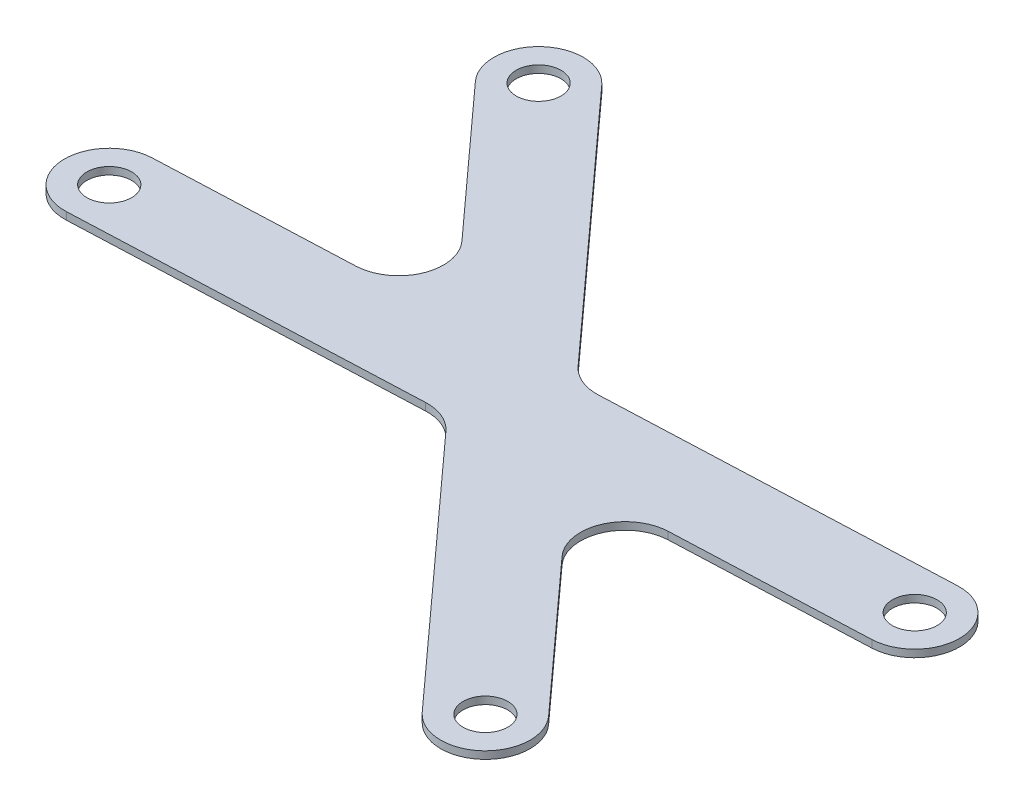
ISO-10303-21;
HEADER;
FILE_DESCRIPTION(('STEP AP214'),'2;1');
FILE_NAME('part.step','',(''),(''),'','','');
FILE_SCHEMA(('AUTOMOTIVE_DESIGN { 1 0 10303 214 1 1 1 1 }'));
ENDSEC;
DATA;
#1=APPLICATION_CONTEXT('core data for automotive mechanical design processes');
#2=APPLICATION_PROTOCOL_DEFINITION('international standard','automotive_design',2000,#1);
#3=PRODUCT_CONTEXT('',#1,'mechanical');
#4=PRODUCT('Part','Part','',(#3));
#5=PRODUCT_RELATED_PRODUCT_CATEGORY('part','',(#4));
#6=PRODUCT_DEFINITION_FORMATION('','',#4);
#7=PRODUCT_DEFINITION_CONTEXT('part definition',#1,'design');
#8=PRODUCT_DEFINITION('design','',#6,#7);
#9=PRODUCT_DEFINITION_SHAPE('','',#8);
#10=(LENGTH_UNIT() NAMED_UNIT(*) SI_UNIT(.MILLI.,.METRE.));
#11=(NAMED_UNIT(*) PLANE_ANGLE_UNIT() SI_UNIT($,.RADIAN.));
#12=(NAMED_UNIT(*) SI_UNIT($,.STERADIAN.) SOLID_ANGLE_UNIT());
#13=UNCERTAINTY_MEASURE_WITH_UNIT(LENGTH_MEASURE(1.E-05),#10,'distance_accuracy_value','');
#14=(GEOMETRIC_REPRESENTATION_CONTEXT(3) GLOBAL_UNCERTAINTY_ASSIGNED_CONTEXT((#13)) GLOBAL_UNIT_ASSIGNED_CONTEXT((#10,
#11,#12)) REPRESENTATION_CONTEXT('',''));
#15=CARTESIAN_POINT('',(0.,0.,0.));
#16=DIRECTION('',(0.,0.,1.));
#17=DIRECTION('',(1.,0.,0.));
#18=AXIS2_PLACEMENT_3D('',#15,#16,#17);
#19=CARTESIAN_POINT('',(-5.11351302513072,1.,12.2230484153319));
#20=DIRECTION('',(0.,-1.,0.));
#21=DIRECTION('',(0.,0.,-1.));
#22=AXIS2_PLACEMENT_3D('',#19,#20,#21);
#23=CYLINDRICAL_SURFACE('',#22,6.);
#24=DIRECTION('',(0.,1.,0.));
#25=VECTOR('',#24,1.);
#26=CARTESIAN_POINT('',(-5.36284124439167,1.,6.228231033703));
#27=LINE('',#26,#25);
#28=CARTESIAN_POINT('',(-5.36284124439167,0.,6.228231033703));
#29=VERTEX_POINT('',#28);
#30=CARTESIAN_POINT('',(-5.36284124439167,1.,6.228231033703));
#31=VERTEX_POINT('',#30);
#32=EDGE_CURVE('E11',#29,#31,#27,.T.);
#33=ORIENTED_EDGE('',*,*,#32,.F.);
#34=CARTESIAN_POINT('',(-5.11351302513072,0.,12.2230484153319));
#35=DIRECTION('',(0.,-1.,0.));
#36=DIRECTION('',(0.,0.,-1.));
#37=AXIS2_PLACEMENT_3D('',#34,#35,#36);
#38=CIRCLE('',#37,6.);
#39=CARTESIAN_POINT('',(-0.66969900100021,0.,8.19160736789726));
#40=VERTEX_POINT('',#39);
#41=EDGE_CURVE('E130',#29,#40,#38,.T.);
#42=ORIENTED_EDGE('',*,*,#41,.T.);
#43=DIRECTION('',(0.,1.,0.));
#44=VECTOR('',#43,1.);
#45=CARTESIAN_POINT('',(-0.669699001000211,1.,8.19160736789726));
#46=LINE('',#45,#44);
#47=CARTESIAN_POINT('',(-0.669699001000211,1.,8.19160736789726));
#48=VERTEX_POINT('',#47);
#49=EDGE_CURVE('E47',#40,#48,#46,.T.);
#50=ORIENTED_EDGE('',*,*,#49,.T.);
#51=CARTESIAN_POINT('',(-5.11351302513072,1.,12.2230484153319));
#52=DIRECTION('',(0.,-1.,0.));
#53=DIRECTION('',(0.,0.,-1.));
#54=AXIS2_PLACEMENT_3D('',#51,#52,#53);
#55=CIRCLE('',#54,6.);
#56=EDGE_CURVE('E229',#31,#48,#55,.T.);
#57=ORIENTED_EDGE('',*,*,#56,.F.);
#58=EDGE_LOOP('',(#33,#42,#50,#57));
#59=FACE_BOUND('',#58,.T.);
#60=ADVANCED_FACE('F37',(#59),#23,.F.);
#61=CARTESIAN_POINT('',(-0.669699001000211,1.,8.19160736789726));
#62=DIRECTION('',(0.740635670688418,0.,-0.671906841239109));
#63=DIRECTION('',(0.671906841239109,0.,0.740635670688418));
#64=AXIS2_PLACEMENT_3D('',#61,#62,#63);
#65=PLANE('',#64);
#66=ORIENTED_EDGE('',*,*,#49,.F.);
#67=DIRECTION('',(0.671906841239109,0.,0.740635670688418));
#68=VECTOR('',#67,1.);
#69=CARTESIAN_POINT('',(-0.669699001000211,0.,8.19160736789726));
#70=LINE('',#69,#68);
#71=CARTESIAN_POINT('',(30.4242022271197,0.,42.4660796264892));
#72=VERTEX_POINT('',#71);
#73=EDGE_CURVE('E173',#40,#72,#70,.T.);
#74=ORIENTED_EDGE('',*,*,#73,.T.);
#75=DIRECTION('',(0.,1.,0.));
#76=VECTOR('',#75,1.);
#77=CARTESIAN_POINT('',(30.4242022271197,1.,42.4660796264892));
#78=LINE('',#77,#76);
#79=CARTESIAN_POINT('',(30.4242022271197,1.,42.4660796264892));
#80=VERTEX_POINT('',#79);
#81=EDGE_CURVE('E222',#72,#80,#78,.T.);
#82=ORIENTED_EDGE('',*,*,#81,.T.);
#83=DIRECTION('',(0.671906841239109,0.,0.740635670688418));
#84=VECTOR('',#83,1.);
#85=CARTESIAN_POINT('',(-0.669699001000211,1.,8.19160736789726));
#86=LINE('',#85,#84);
#87=EDGE_CURVE('E239',#48,#80,#86,.T.);
#88=ORIENTED_EDGE('',*,*,#87,.F.);
#89=EDGE_LOOP('',(#66,#74,#82,#88));
#90=FACE_BOUND('',#89,.T.);
#91=ADVANCED_FACE('F242',(#90),#65,.F.);
#92=CARTESIAN_POINT('',(34.8680162512502,1.,38.4346385790546));
#93=DIRECTION('',(0.,1.,0.));
#94=DIRECTION('',(0.,0.,1.));
#95=AXIS2_PLACEMENT_3D('',#92,#93,#94);
#96=CYLINDRICAL_SURFACE('',#95,5.99999999999999);
#97=ORIENTED_EDGE('',*,*,#81,.F.);
#98=CARTESIAN_POINT('',(34.8680162512502,0.,38.4346385790546));
#99=DIRECTION('',(0.,1.,0.));
#100=DIRECTION('',(0.,0.,1.));
#101=AXIS2_PLACEMENT_3D('',#98,#99,#100);
#102=CIRCLE('',#101,5.99999999999999);
#103=CARTESIAN_POINT('',(39.3118302753807,0.,34.4031975316199));
#104=VERTEX_POINT('',#103);
#105=EDGE_CURVE('E170',#72,#104,#102,.T.);
#106=ORIENTED_EDGE('',*,*,#105,.T.);
#107=DIRECTION('',(0.,1.,0.));
#108=VECTOR('',#107,1.);
#109=CARTESIAN_POINT('',(39.3118302753807,1.,34.4031975316199));
#110=LINE('',#109,#108);
#111=CARTESIAN_POINT('',(39.3118302753807,1.,34.4031975316199));
#112=VERTEX_POINT('',#111);
#113=EDGE_CURVE('E219',#104,#112,#110,.T.);
#114=ORIENTED_EDGE('',*,*,#113,.T.);
#115=CARTESIAN_POINT('',(34.8680162512502,1.,38.4346385790546));
#116=DIRECTION('',(0.,1.,0.));
#117=DIRECTION('',(0.,0.,-1.));
#118=AXIS2_PLACEMENT_3D('',#115,#116,#117);
#119=CIRCLE('',#118,5.99999999999999);
#120=EDGE_CURVE('E243',#80,#112,#119,.T.);
#121=ORIENTED_EDGE('',*,*,#120,.F.);
#122=EDGE_LOOP('',(#97,#106,#114,#121));
#123=FACE_BOUND('',#122,.T.);
#124=ADVANCED_FACE('F308',(#123),#96,.T.);
#125=CARTESIAN_POINT('',(21.6690621358967,1.,14.9557643283957));
#126=DIRECTION('',(-0.740635670688418,0.,0.671906841239109));
#127=DIRECTION('',(-0.671906841239109,0.,-0.740635670688418));
#128=AXIS2_PLACEMENT_3D('',#125,#126,#127);
#129=PLANE('',#128);
#130=ORIENTED_EDGE('',*,*,#113,.F.);
#131=DIRECTION('',(-0.671906841239109,0.,-0.740635670688418));
#132=VECTOR('',#131,1.);
#133=CARTESIAN_POINT('',(21.6690621358967,0.,14.9557643283957));
#134=LINE('',#133,#132);
#135=CARTESIAN_POINT('',(21.6690621358967,0.,14.9557643283957));
#136=VERTEX_POINT('',#135);
#137=EDGE_CURVE('E167',#104,#136,#134,.T.);
#138=ORIENTED_EDGE('',*,*,#137,.T.);
#139=DIRECTION('',(0.,1.,0.));
#140=VECTOR('',#139,1.);
#141=CARTESIAN_POINT('',(21.6690621358967,1.,14.9557643283957));
#142=LINE('',#141,#140);
#143=CARTESIAN_POINT('',(21.6690621358967,1.,14.9557643283957));
#144=VERTEX_POINT('',#143);
#145=EDGE_CURVE('E216',#136,#144,#142,.T.);
#146=ORIENTED_EDGE('',*,*,#145,.T.);
#147=DIRECTION('',(-0.671906841239109,0.,-0.740635670688418));
#148=VECTOR('',#147,1.);
#149=CARTESIAN_POINT('',(21.6690621358967,1.,14.9557643283957));
#150=LINE('',#149,#148);
#151=EDGE_CURVE('E245',#112,#144,#150,.T.);
#152=ORIENTED_EDGE('',*,*,#151,.F.);
#153=EDGE_LOOP('',(#130,#138,#146,#152));
#154=FACE_BOUND('',#153,.T.);
#155=ADVANCED_FACE('F372',(#154),#129,.F.);
#156=CARTESIAN_POINT('',(26.1128761600272,1.,10.924323280961));
#157=DIRECTION('',(0.,-1.,0.));
#158=DIRECTION('',(0.,0.,-1.));
#159=AXIS2_PLACEMENT_3D('',#156,#157,#158);
#160=CYLINDRICAL_SURFACE('',#159,6.);
#161=ORIENTED_EDGE('',*,*,#145,.F.);
#162=CARTESIAN_POINT('',(26.1128761600272,0.,10.924323280961));
#163=DIRECTION('',(0.,-1.,0.));
#164=DIRECTION('',(0.,0.,-1.));
#165=AXIS2_PLACEMENT_3D('',#162,#163,#164);
#166=CIRCLE('',#165,6.);
#167=CARTESIAN_POINT('',(25.8635479407663,0.,4.92950589933213));
#168=VERTEX_POINT('',#167);
#169=EDGE_CURVE('E164',#136,#168,#166,.T.);
#170=ORIENTED_EDGE('',*,*,#169,.T.);
#171=DIRECTION('',(0.,1.,0.));
#172=VECTOR('',#171,1.);
#173=CARTESIAN_POINT('',(25.8635479407663,1.,4.92950589933213));
#174=LINE('',#173,#172);
#175=CARTESIAN_POINT('',(25.8635479407663,1.,4.92950589933213));
#176=VERTEX_POINT('',#175);
#177=EDGE_CURVE('E213',#168,#176,#174,.T.);
#178=ORIENTED_EDGE('',*,*,#177,.T.);
#179=CARTESIAN_POINT('',(26.1128761600272,1.,10.924323280961));
#180=DIRECTION('',(0.,-1.,0.));
#181=DIRECTION('',(0.,0.,-1.));
#182=AXIS2_PLACEMENT_3D('',#179,#180,#181);
#183=CIRCLE('',#182,6.);
#184=EDGE_CURVE('E251',#144,#176,#183,.T.);
#185=ORIENTED_EDGE('',*,*,#184,.F.);
#186=EDGE_LOOP('',(#161,#170,#178,#185));
#187=FACE_BOUND('',#186,.T.);
#188=ADVANCED_FACE('F382',(#187),#160,.F.);
#189=CARTESIAN_POINT('',(52.0986266280583,1.,3.83837250278885));
#190=DIRECTION('',(-0.0415547032101586,0.,-0.999136230271486));
#191=DIRECTION('',(0.999136230271486,0.,-0.0415547032101586));
#192=AXIS2_PLACEMENT_3D('',#189,#190,#191);
#193=PLANE('',#192);
#194=ORIENTED_EDGE('',*,*,#177,.F.);
#195=DIRECTION('',(0.999136230271486,0.,-0.0415547032101586));
#196=VECTOR('',#195,1.);
#197=CARTESIAN_POINT('',(52.0986266280583,0.,3.83837250278885));
#198=LINE('',#197,#196);
#199=CARTESIAN_POINT('',(52.0986266280583,0.,3.83837250278885));
#200=VERTEX_POINT('',#199);
#201=EDGE_CURVE('E161',#168,#200,#198,.T.);
#202=ORIENTED_EDGE('',*,*,#201,.T.);
#203=DIRECTION('',(0.,1.,0.));
#204=VECTOR('',#203,1.);
#205=CARTESIAN_POINT('',(52.0986266280583,1.,3.83837250278885));
#206=LINE('',#205,#204);
#207=CARTESIAN_POINT('',(52.0986266280583,1.,3.83837250278885));
#208=VERTEX_POINT('',#207);
#209=EDGE_CURVE('E210',#200,#208,#206,.T.);
#210=ORIENTED_EDGE('',*,*,#209,.T.);
#211=DIRECTION('',(0.999136230271486,0.,-0.0415547032101586));
#212=VECTOR('',#211,1.);
#213=CARTESIAN_POINT('',(52.0986266280583,1.,3.83837250278885));
#214=LINE('',#213,#212);
#215=EDGE_CURVE('E254',#176,#208,#214,.T.);
#216=ORIENTED_EDGE('',*,*,#215,.F.);
#217=EDGE_LOOP('',(#194,#202,#210,#216));
#218=FACE_BOUND('',#217,.T.);
#219=ADVANCED_FACE('F393',(#218),#193,.F.);
#220=CARTESIAN_POINT('',(51.8492984087974,1.,-2.15644487884007));
#221=DIRECTION('',(0.,1.,0.));
#222=DIRECTION('',(0.,0.,1.));
#223=AXIS2_PLACEMENT_3D('',#220,#221,#222);
#224=CYLINDRICAL_SURFACE('',#223,6.);
#225=ORIENTED_EDGE('',*,*,#209,.F.);
#226=CARTESIAN_POINT('',(51.8492984087974,0.,-2.15644487884007));
#227=DIRECTION('',(0.,1.,0.));
#228=DIRECTION('',(0.,0.,1.));
#229=AXIS2_PLACEMENT_3D('',#226,#227,#228);
#230=CIRCLE('',#229,6.);
#231=CARTESIAN_POINT('',(51.5999701895364,0.,-8.15126226046898));
#232=VERTEX_POINT('',#231);
#233=EDGE_CURVE('E158',#200,#232,#230,.T.);
#234=ORIENTED_EDGE('',*,*,#233,.T.);
#235=DIRECTION('',(0.,1.,0.));
#236=VECTOR('',#235,1.);
#237=CARTESIAN_POINT('',(51.5999701895364,1.,-8.15126226046898));
#238=LINE('',#237,#236);
#239=CARTESIAN_POINT('',(51.5999701895364,1.,-8.15126226046898));
#240=VERTEX_POINT('',#239);
#241=EDGE_CURVE('E207',#232,#240,#238,.T.);
#242=ORIENTED_EDGE('',*,*,#241,.T.);
#243=CARTESIAN_POINT('',(51.8492984087974,1.,-2.15644487884007));
#244=DIRECTION('',(0.,1.,0.));
#245=DIRECTION('',(0.,0.,1.));
#246=AXIS2_PLACEMENT_3D('',#243,#244,#245);
#247=CIRCLE('',#246,6.);
#248=EDGE_CURVE('E257',#208,#240,#247,.T.);
#249=ORIENTED_EDGE('',*,*,#248,.F.);
#250=EDGE_LOOP('',(#225,#234,#242,#249));
#251=FACE_BOUND('',#250,.T.);
#252=ADVANCED_FACE('F404',(#251),#224,.T.);
#253=CARTESIAN_POINT('',(5.36284124439164,1.,-6.228231033703));
#254=DIRECTION('',(0.0415547032101585,0.,0.999136230271486));
#255=DIRECTION('',(-0.999136230271486,0.,0.0415547032101585));
#256=AXIS2_PLACEMENT_3D('',#253,#254,#255);
#257=PLANE('',#256);
#258=ORIENTED_EDGE('',*,*,#241,.F.);
#259=DIRECTION('',(-0.999136230271486,0.,0.0415547032101585));
#260=VECTOR('',#259,1.);
#261=CARTESIAN_POINT('',(5.36284124439164,0.,-6.228231033703));
#262=LINE('',#261,#260);
#263=CARTESIAN_POINT('',(5.36284124439164,0.,-6.228231033703));
#264=VERTEX_POINT('',#263);
#265=EDGE_CURVE('E155',#232,#264,#262,.T.);
#266=ORIENTED_EDGE('',*,*,#265,.T.);
#267=DIRECTION('',(0.,1.,0.));
#268=VECTOR('',#267,1.);
#269=CARTESIAN_POINT('',(5.36284124439164,1.,-6.228231033703));
#270=LINE('',#269,#268);
#271=CARTESIAN_POINT('',(5.36284124439164,1.,-6.228231033703));
#272=VERTEX_POINT('',#271);
#273=EDGE_CURVE('E204',#264,#272,#270,.T.);
#274=ORIENTED_EDGE('',*,*,#273,.T.);
#275=DIRECTION('',(-0.999136230271486,0.,0.0415547032101585));
#276=VECTOR('',#275,1.);
#277=CARTESIAN_POINT('',(5.36284124439164,1.,-6.228231033703));
#278=LINE('',#277,#276);
#279=EDGE_CURVE('E260',#240,#272,#278,.T.);
#280=ORIENTED_EDGE('',*,*,#279,.F.);
#281=EDGE_LOOP('',(#258,#266,#274,#280));
#282=FACE_BOUND('',#281,.T.);
#283=ADVANCED_FACE('F415',(#282),#257,.F.);
#284=CARTESIAN_POINT('',(5.11351302513069,1.,-12.2230484153319));
#285=DIRECTION('',(0.,-1.,0.));
#286=DIRECTION('',(0.,0.,-1.));
#287=AXIS2_PLACEMENT_3D('',#284,#285,#286);
#288=CYLINDRICAL_SURFACE('',#287,6.);
#289=ORIENTED_EDGE('',*,*,#273,.F.);
#290=CARTESIAN_POINT('',(5.11351302513069,0.,-12.2230484153319));
#291=DIRECTION('',(0.,-1.,0.));
#292=DIRECTION('',(0.,0.,-1.));
#293=AXIS2_PLACEMENT_3D('',#290,#291,#292);
#294=CIRCLE('',#293,6.);
#295=CARTESIAN_POINT('',(0.669699001000189,0.,-8.19160736789726));
#296=VERTEX_POINT('',#295);
#297=EDGE_CURVE('E152',#264,#296,#294,.T.);
#298=ORIENTED_EDGE('',*,*,#297,.T.);
#299=DIRECTION('',(0.,1.,0.));
#300=VECTOR('',#299,1.);
#301=CARTESIAN_POINT('',(0.669699001000186,1.,-8.19160736789726));
#302=LINE('',#301,#300);
#303=CARTESIAN_POINT('',(0.669699001000186,1.,-8.19160736789726));
#304=VERTEX_POINT('',#303);
#305=EDGE_CURVE('E201',#296,#304,#302,.T.);
#306=ORIENTED_EDGE('',*,*,#305,.T.);
#307=CARTESIAN_POINT('',(5.11351302513069,1.,-12.2230484153319));
#308=DIRECTION('',(0.,-1.,0.));
#309=DIRECTION('',(0.,0.,-1.));
#310=AXIS2_PLACEMENT_3D('',#307,#308,#309);
#311=CIRCLE('',#310,6.);
#312=EDGE_CURVE('E263',#272,#304,#311,.T.);
#313=ORIENTED_EDGE('',*,*,#312,.F.);
#314=EDGE_LOOP('',(#289,#298,#306,#313));
#315=FACE_BOUND('',#314,.T.);
#316=ADVANCED_FACE('F426',(#315),#288,.F.);
#317=CARTESIAN_POINT('',(-30.4242022271197,1.,-42.4660796264892));
#318=DIRECTION('',(-0.740635670688418,0.,0.671906841239109));
#319=DIRECTION('',(-0.671906841239109,0.,-0.740635670688418));
#320=AXIS2_PLACEMENT_3D('',#317,#318,#319);
#321=PLANE('',#320);
#322=ORIENTED_EDGE('',*,*,#305,.F.);
#323=DIRECTION('',(-0.671906841239109,0.,-0.740635670688418));
#324=VECTOR('',#323,1.);
#325=CARTESIAN_POINT('',(-30.4242022271197,0.,-42.4660796264892));
#326=LINE('',#325,#324);
#327=CARTESIAN_POINT('',(-30.4242022271197,0.,-42.4660796264892));
#328=VERTEX_POINT('',#327);
#329=EDGE_CURVE('E149',#296,#328,#326,.T.);
#330=ORIENTED_EDGE('',*,*,#329,.T.);
#331=DIRECTION('',(0.,1.,0.));
#332=VECTOR('',#331,1.);
#333=CARTESIAN_POINT('',(-30.4242022271197,1.,-42.4660796264892));
#334=LINE('',#333,#332);
#335=CARTESIAN_POINT('',(-30.4242022271197,1.,-42.4660796264892));
#336=VERTEX_POINT('',#335);
#337=EDGE_CURVE('E198',#328,#336,#334,.T.);
#338=ORIENTED_EDGE('',*,*,#337,.T.);
#339=DIRECTION('',(-0.671906841239109,0.,-0.740635670688418));
#340=VECTOR('',#339,1.);
#341=CARTESIAN_POINT('',(-30.4242022271197,1.,-42.4660796264892));
#342=LINE('',#341,#340);
#343=EDGE_CURVE('E266',#304,#336,#342,.T.);
#344=ORIENTED_EDGE('',*,*,#343,.F.);
#345=EDGE_LOOP('',(#322,#330,#338,#344));
#346=FACE_BOUND('',#345,.T.);
#347=ADVANCED_FACE('F437',(#346),#321,.F.);
#348=CARTESIAN_POINT('',(-34.8680162512502,1.,-38.4346385790546));
#349=DIRECTION('',(0.,1.,0.));
#350=DIRECTION('',(0.,0.,1.));
#351=AXIS2_PLACEMENT_3D('',#348,#349,#350);
#352=CYLINDRICAL_SURFACE('',#351,5.99999999999999);
#353=ORIENTED_EDGE('',*,*,#337,.F.);
#354=CARTESIAN_POINT('',(-34.8680162512502,0.,-38.4346385790546));
#355=DIRECTION('',(0.,1.,0.));
#356=DIRECTION('',(0.,0.,1.));
#357=AXIS2_PLACEMENT_3D('',#354,#355,#356);
#358=CIRCLE('',#357,5.99999999999999);
#359=CARTESIAN_POINT('',(-39.3118302753807,0.,-34.4031975316199));
#360=VERTEX_POINT('',#359);
#361=EDGE_CURVE('E146',#328,#360,#358,.T.);
#362=ORIENTED_EDGE('',*,*,#361,.T.);
#363=DIRECTION('',(0.,1.,0.));
#364=VECTOR('',#363,1.);
#365=CARTESIAN_POINT('',(-39.3118302753807,1.,-34.4031975316199));
#366=LINE('',#365,#364);
#367=CARTESIAN_POINT('',(-39.3118302753807,1.,-34.4031975316199));
#368=VERTEX_POINT('',#367);
#369=EDGE_CURVE('E195',#360,#368,#366,.T.);
#370=ORIENTED_EDGE('',*,*,#369,.T.);
#371=CARTESIAN_POINT('',(-34.8680162512502,1.,-38.4346385790546));
#372=DIRECTION('',(0.,1.,0.));
#373=DIRECTION('',(0.,0.,1.));
#374=AXIS2_PLACEMENT_3D('',#371,#372,#373);
#375=CIRCLE('',#374,5.99999999999999);
#376=EDGE_CURVE('E269',#336,#368,#375,.T.);
#377=ORIENTED_EDGE('',*,*,#376,.F.);
#378=EDGE_LOOP('',(#353,#362,#370,#377));
#379=FACE_BOUND('',#378,.T.);
#380=ADVANCED_FACE('F448',(#379),#352,.T.);
#381=CARTESIAN_POINT('',(-21.6690621358967,1.,-14.9557643283957));
#382=DIRECTION('',(0.740635670688418,0.,-0.67190684123911));
#383=DIRECTION('',(0.671906841239109,0.,0.740635670688418));
#384=AXIS2_PLACEMENT_3D('',#381,#382,#383);
#385=PLANE('',#384);
#386=ORIENTED_EDGE('',*,*,#369,.F.);
#387=DIRECTION('',(0.671906841239109,0.,0.740635670688418));
#388=VECTOR('',#387,1.);
#389=CARTESIAN_POINT('',(-21.6690621358967,0.,-14.9557643283957));
#390=LINE('',#389,#388);
#391=CARTESIAN_POINT('',(-21.6690621358967,0.,-14.9557643283957));
#392=VERTEX_POINT('',#391);
#393=EDGE_CURVE('E143',#360,#392,#390,.T.);
#394=ORIENTED_EDGE('',*,*,#393,.T.);
#395=DIRECTION('',(0.,1.,0.));
#396=VECTOR('',#395,1.);
#397=CARTESIAN_POINT('',(-21.6690621358967,1.,-14.9557643283957));
#398=LINE('',#397,#396);
#399=CARTESIAN_POINT('',(-21.6690621358967,1.,-14.9557643283957));
#400=VERTEX_POINT('',#399);
#401=EDGE_CURVE('E192',#392,#400,#398,.T.);
#402=ORIENTED_EDGE('',*,*,#401,.T.);
#403=DIRECTION('',(0.671906841239109,0.,0.740635670688418));
#404=VECTOR('',#403,1.);
#405=CARTESIAN_POINT('',(-21.6690621358967,1.,-14.9557643283957));
#406=LINE('',#405,#404);
#407=EDGE_CURVE('E272',#368,#400,#406,.T.);
#408=ORIENTED_EDGE('',*,*,#407,.F.);
#409=EDGE_LOOP('',(#386,#394,#402,#408));
#410=FACE_BOUND('',#409,.T.);
#411=ADVANCED_FACE('F459',(#410),#385,.F.);
#412=CARTESIAN_POINT('',(-26.1128761600273,1.,-10.924323280961));
#413=DIRECTION('',(0.,-1.,0.));
#414=DIRECTION('',(0.,0.,-1.));
#415=AXIS2_PLACEMENT_3D('',#412,#413,#414);
#416=CYLINDRICAL_SURFACE('',#415,6.);
#417=ORIENTED_EDGE('',*,*,#401,.F.);
#418=CARTESIAN_POINT('',(-26.1128761600273,0.,-10.924323280961));
#419=DIRECTION('',(0.,-1.,0.));
#420=DIRECTION('',(0.,0.,-1.));
#421=AXIS2_PLACEMENT_3D('',#418,#419,#420);
#422=CIRCLE('',#421,6.);
#423=CARTESIAN_POINT('',(-25.8635479407663,0.,-4.92950589933213));
#424=VERTEX_POINT('',#423);
#425=EDGE_CURVE('E140',#392,#424,#422,.T.);
#426=ORIENTED_EDGE('',*,*,#425,.T.);
#427=DIRECTION('',(0.,1.,0.));
#428=VECTOR('',#427,1.);
#429=CARTESIAN_POINT('',(-25.8635479407663,1.,-4.92950589933213));
#430=LINE('',#429,#428);
#431=CARTESIAN_POINT('',(-25.8635479407663,1.,-4.92950589933213));
#432=VERTEX_POINT('',#431);
#433=EDGE_CURVE('E190',#424,#432,#430,.T.);
#434=ORIENTED_EDGE('',*,*,#433,.T.);
#435=CARTESIAN_POINT('',(-26.1128761600273,1.,-10.924323280961));
#436=DIRECTION('',(0.,-1.,0.));
#437=DIRECTION('',(0.,0.,-1.));
#438=AXIS2_PLACEMENT_3D('',#435,#436,#437);
#439=CIRCLE('',#438,6.);
#440=EDGE_CURVE('E275',#400,#432,#439,.T.);
#441=ORIENTED_EDGE('',*,*,#440,.F.);
#442=EDGE_LOOP('',(#417,#426,#434,#441));
#443=FACE_BOUND('',#442,.T.);
#444=ADVANCED_FACE('F470',(#443),#416,.F.);
#445=CARTESIAN_POINT('',(-52.0986266280584,1.,-3.83837250278885));
#446=DIRECTION('',(0.0415547032101586,0.,0.999136230271486));
#447=DIRECTION('',(-0.999136230271486,0.,0.0415547032101586));
#448=AXIS2_PLACEMENT_3D('',#445,#446,#447);
#449=PLANE('',#448);
#450=ORIENTED_EDGE('',*,*,#433,.F.);
#451=DIRECTION('',(-0.999136230271486,0.,0.0415547032101586));
#452=VECTOR('',#451,1.);
#453=CARTESIAN_POINT('',(-52.0986266280584,0.,-3.83837250278885));
#454=LINE('',#453,#452);
#455=CARTESIAN_POINT('',(-52.0986266280584,0.,-3.83837250278885));
#456=VERTEX_POINT('',#455);
#457=EDGE_CURVE('E137',#424,#456,#454,.T.);
#458=ORIENTED_EDGE('',*,*,#457,.T.);
#459=DIRECTION('',(0.,1.,0.));
#460=VECTOR('',#459,1.);
#461=CARTESIAN_POINT('',(-52.0986266280584,1.,-3.83837250278885));
#462=LINE('',#461,#460);
#463=CARTESIAN_POINT('',(-52.0986266280584,1.,-3.83837250278885));
#464=VERTEX_POINT('',#463);
#465=EDGE_CURVE('E55',#456,#464,#462,.T.);
#466=ORIENTED_EDGE('',*,*,#465,.T.);
#467=DIRECTION('',(-0.999136230271486,0.,0.0415547032101586));
#468=VECTOR('',#467,1.);
#469=CARTESIAN_POINT('',(-52.0986266280584,1.,-3.83837250278885));
#470=LINE('',#469,#468);
#471=EDGE_CURVE('E278',#432,#464,#470,.T.);
#472=ORIENTED_EDGE('',*,*,#471,.F.);
#473=EDGE_LOOP('',(#450,#458,#466,#472));
#474=FACE_BOUND('',#473,.T.);
#475=ADVANCED_FACE('F481',(#474),#449,.F.);
#476=CARTESIAN_POINT('',(-51.8492984087974,1.,2.15644487884007));
#477=DIRECTION('',(0.,1.,0.));
#478=DIRECTION('',(0.,0.,1.));
#479=AXIS2_PLACEMENT_3D('',#476,#477,#478);
#480=CYLINDRICAL_SURFACE('',#479,6.);
#481=ORIENTED_EDGE('',*,*,#465,.F.);
#482=CARTESIAN_POINT('',(-51.8492984087974,0.,2.15644487884007));
#483=DIRECTION('',(0.,1.,0.));
#484=DIRECTION('',(0.,0.,1.));
#485=AXIS2_PLACEMENT_3D('',#482,#483,#484);
#486=CIRCLE('',#485,6.);
#487=CARTESIAN_POINT('',(-51.5999701895365,0.,8.15126226046898));
#488=VERTEX_POINT('',#487);
#489=EDGE_CURVE('E128',#456,#488,#486,.T.);
#490=ORIENTED_EDGE('',*,*,#489,.T.);
#491=DIRECTION('',(0.,1.,0.));
#492=VECTOR('',#491,1.);
#493=CARTESIAN_POINT('',(-51.5999701895365,1.,8.15126226046898));
#494=LINE('',#493,#492);
#495=CARTESIAN_POINT('',(-51.5999701895365,1.,8.15126226046898));
#496=VERTEX_POINT('',#495);
#497=EDGE_CURVE('E41',#488,#496,#494,.T.);
#498=ORIENTED_EDGE('',*,*,#497,.T.);
#499=CARTESIAN_POINT('',(-51.8492984087974,1.,2.15644487884007));
#500=DIRECTION('',(0.,1.,0.));
#501=DIRECTION('',(0.,0.,-1.));
#502=AXIS2_PLACEMENT_3D('',#499,#500,#501);
#503=CIRCLE('',#502,6.);
#504=EDGE_CURVE('E188',#464,#496,#503,.T.);
#505=ORIENTED_EDGE('',*,*,#504,.F.);
#506=EDGE_LOOP('',(#481,#490,#498,#505));
#507=FACE_BOUND('',#506,.T.);
#508=ADVANCED_FACE('F132',(#507),#480,.T.);
#509=CARTESIAN_POINT('',(-51.5999701895365,1.,8.15126226046898));
#510=DIRECTION('',(-0.0415547032101583,0.,-0.999136230271486));
#511=DIRECTION('',(0.999136230271486,0.,-0.0415547032101583));
#512=AXIS2_PLACEMENT_3D('',#509,#510,#511);
#513=PLANE('',#512);
#514=DIRECTION('',(0.999136230271486,0.,-0.0415547032101583));
#515=VECTOR('',#514,1.);
#516=CARTESIAN_POINT('',(-51.5999701895365,0.,8.15126226046898));
#517=LINE('',#516,#515);
#518=EDGE_CURVE('E116',#488,#29,#517,.T.);
#519=ORIENTED_EDGE('',*,*,#518,.T.);
#520=ORIENTED_EDGE('',*,*,#32,.T.);
#521=DIRECTION('',(0.999136230271486,0.,-0.0415547032101583));
#522=VECTOR('',#521,1.);
#523=CARTESIAN_POINT('',(-51.5999701895365,1.,8.15126226046898));
#524=LINE('',#523,#522);
#525=EDGE_CURVE('E118',#496,#31,#524,.T.);
#526=ORIENTED_EDGE('',*,*,#525,.F.);
#527=ORIENTED_EDGE('',*,*,#497,.F.);
#528=EDGE_LOOP('',(#519,#520,#526,#527));
#529=FACE_BOUND('',#528,.T.);
#530=ADVANCED_FACE('F115',(#529),#513,.F.);
#531=CARTESIAN_POINT('',(-34.8680162512502,1.,-38.4346385790546));
#532=DIRECTION('',(0.,1.,0.));
#533=DIRECTION('',(0.,0.,1.));
#534=AXIS2_PLACEMENT_3D('',#531,#532,#533);
#535=CYLINDRICAL_SURFACE('',#534,3.);
#536=CARTESIAN_POINT('',(-34.8680162512502,1.,-38.4346385790546));
#537=DIRECTION('',(0.,1.,0.));
#538=DIRECTION('',(0.,0.,1.));
#539=AXIS2_PLACEMENT_3D('',#536,#537,#538);
#540=CIRCLE('',#539,3.);
#541=CARTESIAN_POINT('',(-34.8680162512502,1.,-35.4346385790546));
#542=VERTEX_POINT('',#541);
#543=EDGE_CURVE('E281',#542,#542,#540,.T.);
#544=ORIENTED_EDGE('',*,*,#543,.T.);
#545=EDGE_LOOP('',(#544));
#546=FACE_BOUND('',#545,.T.);
#547=CARTESIAN_POINT('',(-34.8680162512502,0.,-38.4346385790546));
#548=DIRECTION('',(0.,1.,0.));
#549=DIRECTION('',(0.,0.,1.));
#550=AXIS2_PLACEMENT_3D('',#547,#548,#549);
#551=CIRCLE('',#550,3.);
#552=CARTESIAN_POINT('',(-34.8680162512502,0.,-35.4346385790546));
#553=VERTEX_POINT('',#552);
#554=EDGE_CURVE('E139',#553,#553,#551,.T.);
#555=ORIENTED_EDGE('',*,*,#554,.F.);
#556=EDGE_LOOP('',(#555));
#557=FACE_BOUND('',#556,.T.);
#558=ADVANCED_FACE('F314',(#546,#557),#535,.F.);
#559=CARTESIAN_POINT('',(51.8492984087974,1.,-2.15644487884007));
#560=DIRECTION('',(0.,1.,0.));
#561=DIRECTION('',(0.,0.,1.));
#562=AXIS2_PLACEMENT_3D('',#559,#560,#561);
#563=CYLINDRICAL_SURFACE('',#562,3.);
#564=CARTESIAN_POINT('',(51.8492984087974,1.,-2.15644487884007));
#565=DIRECTION('',(0.,1.,0.));
#566=DIRECTION('',(0.,0.,1.));
#567=AXIS2_PLACEMENT_3D('',#564,#565,#566);
#568=CIRCLE('',#567,3.);
#569=CARTESIAN_POINT('',(51.8492984087974,1.,0.843555121159934));
#570=VERTEX_POINT('',#569);
#571=EDGE_CURVE('E284',#570,#570,#568,.T.);
#572=ORIENTED_EDGE('',*,*,#571,.T.);
#573=EDGE_LOOP('',(#572));
#574=FACE_BOUND('',#573,.T.);
#575=CARTESIAN_POINT('',(51.8492984087974,0.,-2.15644487884007));
#576=DIRECTION('',(0.,1.,0.));
#577=DIRECTION('',(0.,0.,1.));
#578=AXIS2_PLACEMENT_3D('',#575,#576,#577);
#579=CIRCLE('',#578,3.);
#580=CARTESIAN_POINT('',(51.8492984087974,0.,0.843555121159934));
#581=VERTEX_POINT('',#580);
#582=EDGE_CURVE('E179',#581,#581,#579,.T.);
#583=ORIENTED_EDGE('',*,*,#582,.F.);
#584=EDGE_LOOP('',(#583));
#585=FACE_BOUND('',#584,.T.);
#586=ADVANCED_FACE('F317',(#574,#585),#563,.F.);
#587=CARTESIAN_POINT('',(34.8680162512502,1.,38.4346385790546));
#588=DIRECTION('',(0.,1.,0.));
#589=DIRECTION('',(0.,0.,1.));
#590=AXIS2_PLACEMENT_3D('',#587,#588,#589);
#591=CYLINDRICAL_SURFACE('',#590,2.99999999999999);
#592=CARTESIAN_POINT('',(34.8680162512502,1.,38.4346385790546));
#593=DIRECTION('',(0.,1.,0.));
#594=DIRECTION('',(0.,0.,1.));
#595=AXIS2_PLACEMENT_3D('',#592,#593,#594);
#596=CIRCLE('',#595,2.99999999999999);
#597=CARTESIAN_POINT('',(34.8680162512502,1.,41.4346385790546));
#598=VERTEX_POINT('',#597);
#599=EDGE_CURVE('E286',#598,#598,#596,.T.);
#600=ORIENTED_EDGE('',*,*,#599,.T.);
#601=EDGE_LOOP('',(#600));
#602=FACE_BOUND('',#601,.T.);
#603=CARTESIAN_POINT('',(34.8680162512502,0.,38.4346385790546));
#604=DIRECTION('',(0.,1.,0.));
#605=DIRECTION('',(0.,0.,1.));
#606=AXIS2_PLACEMENT_3D('',#603,#604,#605);
#607=CIRCLE('',#606,2.99999999999999);
#608=CARTESIAN_POINT('',(34.8680162512502,0.,41.4346385790546));
#609=VERTEX_POINT('',#608);
#610=EDGE_CURVE('E182',#609,#609,#607,.T.);
#611=ORIENTED_EDGE('',*,*,#610,.F.);
#612=EDGE_LOOP('',(#611));
#613=FACE_BOUND('',#612,.T.);
#614=ADVANCED_FACE('F302',(#602,#613),#591,.F.);
#615=CARTESIAN_POINT('',(-51.8492984087974,1.,2.15644487884007));
#616=DIRECTION('',(0.,1.,0.));
#617=DIRECTION('',(0.,0.,1.));
#618=AXIS2_PLACEMENT_3D('',#615,#616,#617);
#619=CYLINDRICAL_SURFACE('',#618,3.);
#620=CARTESIAN_POINT('',(-51.8492984087974,1.,2.15644487884007));
#621=DIRECTION('',(0.,1.,0.));
#622=DIRECTION('',(0.,0.,1.));
#623=AXIS2_PLACEMENT_3D('',#620,#621,#622);
#624=CIRCLE('',#623,3.);
#625=CARTESIAN_POINT('',(-51.8492984087974,1.,5.15644487884007));
#626=VERTEX_POINT('',#625);
#627=EDGE_CURVE('E122',#626,#626,#624,.T.);
#628=ORIENTED_EDGE('',*,*,#627,.T.);
#629=EDGE_LOOP('',(#628));
#630=FACE_BOUND('',#629,.T.);
#631=CARTESIAN_POINT('',(-51.8492984087974,0.,2.15644487884007));
#632=DIRECTION('',(0.,1.,0.));
#633=DIRECTION('',(0.,0.,1.));
#634=AXIS2_PLACEMENT_3D('',#631,#632,#633);
#635=CIRCLE('',#634,3.);
#636=CARTESIAN_POINT('',(-51.8492984087974,0.,5.15644487884007));
#637=VERTEX_POINT('',#636);
#638=EDGE_CURVE('E185',#637,#637,#635,.T.);
#639=ORIENTED_EDGE('',*,*,#638,.F.);
#640=EDGE_LOOP('',(#639));
#641=FACE_BOUND('',#640,.T.);
#642=ADVANCED_FACE('F39',(#630,#641),#619,.F.);
#643=CARTESIAN_POINT('',(-51.8492984087974,1.,2.15644487884007));
#644=DIRECTION('',(0.,-1.,0.));
#645=DIRECTION('',(0.,0.,-1.));
#646=AXIS2_PLACEMENT_3D('',#643,#644,#645);
#647=PLANE('',#646);
#648=ORIENTED_EDGE('',*,*,#504,.T.);
#649=ORIENTED_EDGE('',*,*,#525,.T.);
#650=ORIENTED_EDGE('',*,*,#56,.T.);
#651=ORIENTED_EDGE('',*,*,#87,.T.);
#652=ORIENTED_EDGE('',*,*,#120,.T.);
#653=ORIENTED_EDGE('',*,*,#151,.T.);
#654=ORIENTED_EDGE('',*,*,#184,.T.);
#655=ORIENTED_EDGE('',*,*,#215,.T.);
#656=ORIENTED_EDGE('',*,*,#248,.T.);
#657=ORIENTED_EDGE('',*,*,#279,.T.);
#658=ORIENTED_EDGE('',*,*,#312,.T.);
#659=ORIENTED_EDGE('',*,*,#343,.T.);
#660=ORIENTED_EDGE('',*,*,#376,.T.);
#661=ORIENTED_EDGE('',*,*,#407,.T.);
#662=ORIENTED_EDGE('',*,*,#440,.T.);
#663=ORIENTED_EDGE('',*,*,#471,.T.);
#664=EDGE_LOOP('',(#648,#649,#650,#651,#652,#653,#654,#655,#656,#657,#658,#659,#660,#661,#662,#663));
#665=FACE_BOUND('',#664,.T.);
#666=ORIENTED_EDGE('',*,*,#543,.F.);
#667=EDGE_LOOP('',(#666));
#668=FACE_BOUND('',#667,.T.);
#669=ORIENTED_EDGE('',*,*,#571,.F.);
#670=EDGE_LOOP('',(#669));
#671=FACE_BOUND('',#670,.T.);
#672=ORIENTED_EDGE('',*,*,#599,.F.);
#673=EDGE_LOOP('',(#672));
#674=FACE_BOUND('',#673,.T.);
#675=ORIENTED_EDGE('',*,*,#627,.F.);
#676=EDGE_LOOP('',(#675));
#677=FACE_BOUND('',#676,.T.);
#678=ADVANCED_FACE('F236',(#665,#668,#671,#674,#677),#647,.F.);
#679=CARTESIAN_POINT('',(-51.8492984087974,0.,2.15644487884007));
#680=DIRECTION('',(0.,-1.,0.));
#681=DIRECTION('',(0.,0.,-1.));
#682=AXIS2_PLACEMENT_3D('',#679,#680,#681);
#683=PLANE('',#682);
#684=ORIENTED_EDGE('',*,*,#489,.F.);
#685=ORIENTED_EDGE('',*,*,#457,.F.);
#686=ORIENTED_EDGE('',*,*,#425,.F.);
#687=ORIENTED_EDGE('',*,*,#393,.F.);
#688=ORIENTED_EDGE('',*,*,#361,.F.);
#689=ORIENTED_EDGE('',*,*,#329,.F.);
#690=ORIENTED_EDGE('',*,*,#297,.F.);
#691=ORIENTED_EDGE('',*,*,#265,.F.);
#692=ORIENTED_EDGE('',*,*,#233,.F.);
#693=ORIENTED_EDGE('',*,*,#201,.F.);
#694=ORIENTED_EDGE('',*,*,#169,.F.);
#695=ORIENTED_EDGE('',*,*,#137,.F.);
#696=ORIENTED_EDGE('',*,*,#105,.F.);
#697=ORIENTED_EDGE('',*,*,#73,.F.);
#698=ORIENTED_EDGE('',*,*,#41,.F.);
#699=ORIENTED_EDGE('',*,*,#518,.F.);
#700=EDGE_LOOP('',(#684,#685,#686,#687,#688,#689,#690,#691,#692,#693,#694,#695,#696,#697,#698,#699));
#701=FACE_BOUND('',#700,.T.);
#702=ORIENTED_EDGE('',*,*,#554,.T.);
#703=EDGE_LOOP('',(#702));
#704=FACE_BOUND('',#703,.T.);
#705=ORIENTED_EDGE('',*,*,#582,.T.);
#706=EDGE_LOOP('',(#705));
#707=FACE_BOUND('',#706,.T.);
#708=ORIENTED_EDGE('',*,*,#610,.T.);
#709=EDGE_LOOP('',(#708));
#710=FACE_BOUND('',#709,.T.);
#711=ORIENTED_EDGE('',*,*,#638,.T.);
#712=EDGE_LOOP('',(#711));
#713=FACE_BOUND('',#712,.T.);
#714=ADVANCED_FACE('F125',(#701,#704,#707,#710,#713),#683,.T.);
#715=CLOSED_SHELL('',(#60,#91,#124,#155,#188,#219,#252,#283,#316,#347,#380,#411,#444,#475,#508,
#530,#558,#586,#614,#642,#678,#714));
#716=MANIFOLD_SOLID_BREP('B2',#715);
#717=ADVANCED_BREP_SHAPE_REPRESENTATION('',(#18,#716),#14);
#718=SHAPE_DEFINITION_REPRESENTATION(#9,#717);
ENDSEC;
END-ISO-10303-21;
